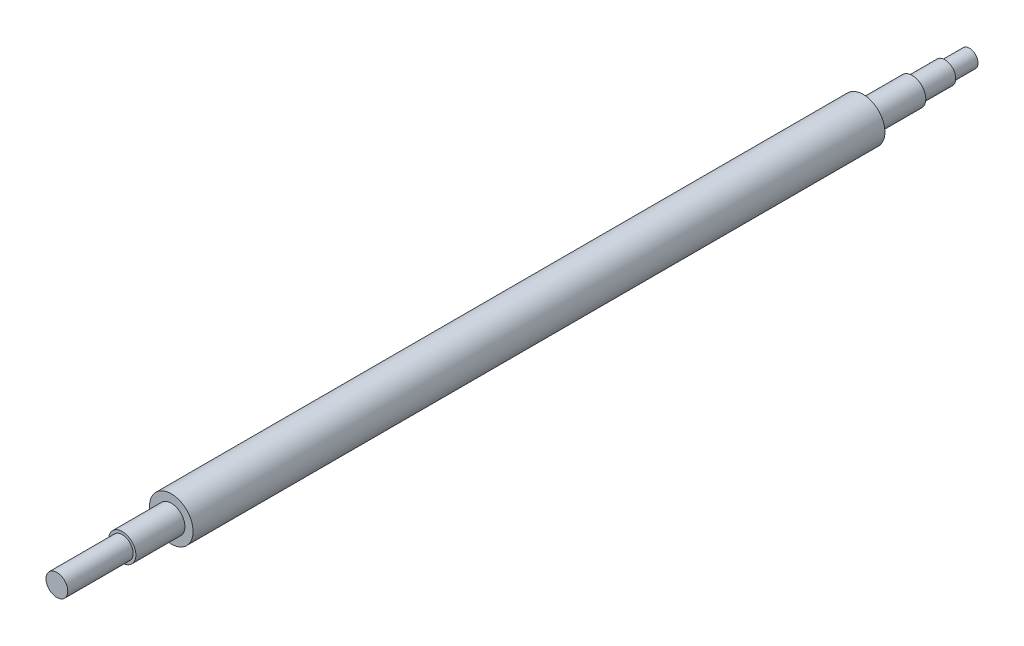
ISO-10303-21;
HEADER;
FILE_DESCRIPTION(('STEP AP214'),'2;1');
FILE_NAME('part.step','',(''),(''),'','','');
FILE_SCHEMA(('AUTOMOTIVE_DESIGN { 1 0 10303 214 1 1 1 1 }'));
ENDSEC;
DATA;
#1=APPLICATION_CONTEXT('core data for automotive mechanical design processes');
#2=APPLICATION_PROTOCOL_DEFINITION('international standard','automotive_design',2000,#1);
#3=PRODUCT_CONTEXT('',#1,'mechanical');
#4=PRODUCT('Part','Part','',(#3));
#5=PRODUCT_RELATED_PRODUCT_CATEGORY('part','',(#4));
#6=PRODUCT_DEFINITION_FORMATION('','',#4);
#7=PRODUCT_DEFINITION_CONTEXT('part definition',#1,'design');
#8=PRODUCT_DEFINITION('design','',#6,#7);
#9=PRODUCT_DEFINITION_SHAPE('','',#8);
#10=(LENGTH_UNIT() NAMED_UNIT(*) SI_UNIT(.MILLI.,.METRE.));
#11=(NAMED_UNIT(*) PLANE_ANGLE_UNIT() SI_UNIT($,.RADIAN.));
#12=(NAMED_UNIT(*) SI_UNIT($,.STERADIAN.) SOLID_ANGLE_UNIT());
#13=UNCERTAINTY_MEASURE_WITH_UNIT(LENGTH_MEASURE(1.E-05),#10,'distance_accuracy_value','');
#14=(GEOMETRIC_REPRESENTATION_CONTEXT(3) GLOBAL_UNCERTAINTY_ASSIGNED_CONTEXT((#13)) GLOBAL_UNIT_ASSIGNED_CONTEXT((#10,
#11,#12)) REPRESENTATION_CONTEXT('',''));
#15=CARTESIAN_POINT('',(0.,0.,0.));
#16=DIRECTION('',(0.,0.,1.));
#17=DIRECTION('',(1.,0.,0.));
#18=AXIS2_PLACEMENT_3D('',#15,#16,#17);
#19=CARTESIAN_POINT('',(0.,0.,296.));
#20=DIRECTION('',(0.,0.,-1.));
#21=DIRECTION('',(-1.,0.,0.));
#22=AXIS2_PLACEMENT_3D('',#19,#20,#21);
#23=CYLINDRICAL_SURFACE('',#22,4.);
#24=CARTESIAN_POINT('',(0.,0.,296.));
#25=DIRECTION('',(0.,0.,1.));
#26=DIRECTION('',(1.,0.,0.));
#27=AXIS2_PLACEMENT_3D('',#24,#25,#26);
#28=CIRCLE('',#27,4.);
#29=CARTESIAN_POINT('',(4.,0.,296.));
#30=VERTEX_POINT('',#29);
#31=EDGE_CURVE('E11',#30,#30,#28,.T.);
#32=ORIENTED_EDGE('',*,*,#31,.F.);
#33=EDGE_LOOP('',(#32));
#34=FACE_BOUND('',#33,.T.);
#35=CARTESIAN_POINT('',(0.,0.,272.));
#36=DIRECTION('',(0.,0.,1.));
#37=DIRECTION('',(1.,0.,0.));
#38=AXIS2_PLACEMENT_3D('',#35,#36,#37);
#39=CIRCLE('',#38,4.);
#40=CARTESIAN_POINT('',(4.,0.,272.));
#41=VERTEX_POINT('',#40);
#42=EDGE_CURVE('E44',#41,#41,#39,.T.);
#43=ORIENTED_EDGE('',*,*,#42,.T.);
#44=EDGE_LOOP('',(#43));
#45=FACE_BOUND('',#44,.T.);
#46=ADVANCED_FACE('F41',(#34,#45),#23,.T.);
#47=CARTESIAN_POINT('',(0.,0.,296.));
#48=DIRECTION('',(0.,0.,1.));
#49=DIRECTION('',(1.,0.,0.));
#50=AXIS2_PLACEMENT_3D('',#47,#48,#49);
#51=PLANE('',#50);
#52=ORIENTED_EDGE('',*,*,#31,.T.);
#53=EDGE_LOOP('',(#52));
#54=FACE_BOUND('',#53,.T.);
#55=ADVANCED_FACE('F56',(#54),#51,.T.);
#56=CARTESIAN_POINT('',(0.,0.,272.));
#57=DIRECTION('',(0.,0.,1.));
#58=DIRECTION('',(1.,0.,0.));
#59=AXIS2_PLACEMENT_3D('',#56,#57,#58);
#60=PLANE('',#59);
#61=ORIENTED_EDGE('',*,*,#42,.F.);
#62=EDGE_LOOP('',(#61));
#63=FACE_BOUND('',#62,.T.);
#64=ADVANCED_FACE('F54',(#63),#60,.F.);
#65=CLOSED_SHELL('',(#46,#55,#64));
#66=MANIFOLD_SOLID_BREP('B2',#65);
#67=CARTESIAN_POINT('',(0.,0.,-30.));
#68=DIRECTION('',(0.,0.,-1.));
#69=DIRECTION('',(-1.,0.,0.));
#70=AXIS2_PLACEMENT_3D('',#67,#68,#69);
#71=PLANE('',#70);
#72=CARTESIAN_POINT('',(0.,0.,-30.));
#73=DIRECTION('',(0.,0.,-1.));
#74=DIRECTION('',(-1.,0.,0.));
#75=AXIS2_PLACEMENT_3D('',#72,#73,#74);
#76=CIRCLE('',#75,4.);
#77=CARTESIAN_POINT('',(-4.,0.,-30.));
#78=VERTEX_POINT('',#77);
#79=EDGE_CURVE('E100',#78,#78,#76,.T.);
#80=ORIENTED_EDGE('',*,*,#79,.T.);
#81=EDGE_LOOP('',(#80));
#82=FACE_BOUND('',#81,.T.);
#83=CARTESIAN_POINT('',(0.,0.,-30.));
#84=DIRECTION('',(0.,0.,-1.));
#85=DIRECTION('',(-1.,0.,0.));
#86=AXIS2_PLACEMENT_3D('',#83,#84,#85);
#87=CIRCLE('',#86,3.175);
#88=CARTESIAN_POINT('',(-3.175,0.,-30.));
#89=VERTEX_POINT('',#88);
#90=EDGE_CURVE('E108',#89,#89,#87,.T.);
#91=ORIENTED_EDGE('',*,*,#90,.F.);
#92=EDGE_LOOP('',(#91));
#93=FACE_BOUND('',#92,.T.);
#94=ADVANCED_FACE('F89',(#82,#93),#71,.T.);
#95=CARTESIAN_POINT('',(0.,0.,-18.));
#96=DIRECTION('',(0.,0.,-1.));
#97=DIRECTION('',(-1.,0.,0.));
#98=AXIS2_PLACEMENT_3D('',#95,#96,#97);
#99=PLANE('',#98);
#100=CARTESIAN_POINT('',(0.,0.,-18.));
#101=DIRECTION('',(0.,0.,-1.));
#102=DIRECTION('',(-1.,0.,0.));
#103=AXIS2_PLACEMENT_3D('',#100,#101,#102);
#104=CIRCLE('',#103,5.);
#105=CARTESIAN_POINT('',(-5.,0.,-18.));
#106=VERTEX_POINT('',#105);
#107=EDGE_CURVE('E40',#106,#106,#104,.T.);
#108=ORIENTED_EDGE('',*,*,#107,.T.);
#109=EDGE_LOOP('',(#108));
#110=FACE_BOUND('',#109,.T.);
#111=CARTESIAN_POINT('',(0.,0.,-18.));
#112=DIRECTION('',(0.,0.,-1.));
#113=DIRECTION('',(-1.,0.,0.));
#114=AXIS2_PLACEMENT_3D('',#111,#112,#113);
#115=CIRCLE('',#114,4.);
#116=CARTESIAN_POINT('',(-4.,0.,-18.));
#117=VERTEX_POINT('',#116);
#118=EDGE_CURVE('E102',#117,#117,#115,.T.);
#119=ORIENTED_EDGE('',*,*,#118,.F.);
#120=EDGE_LOOP('',(#119));
#121=FACE_BOUND('',#120,.T.);
#122=ADVANCED_FACE('F124',(#110,#121),#99,.T.);
#123=CARTESIAN_POINT('',(0.,0.,-18.));
#124=DIRECTION('',(0.,0.,1.));
#125=DIRECTION('',(1.,0.,0.));
#126=AXIS2_PLACEMENT_3D('',#123,#124,#125);
#127=CYLINDRICAL_SURFACE('',#126,5.);
#128=ORIENTED_EDGE('',*,*,#107,.F.);
#129=EDGE_LOOP('',(#128));
#130=FACE_BOUND('',#129,.T.);
#131=CARTESIAN_POINT('',(0.,0.,0.));
#132=DIRECTION('',(0.,0.,-1.));
#133=DIRECTION('',(-1.,0.,0.));
#134=AXIS2_PLACEMENT_3D('',#131,#132,#133);
#135=CIRCLE('',#134,5.);
#136=CARTESIAN_POINT('',(-5.,0.,0.));
#137=VERTEX_POINT('',#136);
#138=EDGE_CURVE('E93',#137,#137,#135,.T.);
#139=ORIENTED_EDGE('',*,*,#138,.T.);
#140=EDGE_LOOP('',(#139));
#141=FACE_BOUND('',#140,.T.);
#142=ADVANCED_FACE('F91',(#130,#141),#127,.T.);
#143=CARTESIAN_POINT('',(0.,0.,0.));
#144=DIRECTION('',(0.,0.,-1.));
#145=DIRECTION('',(-1.,0.,0.));
#146=AXIS2_PLACEMENT_3D('',#143,#144,#145);
#147=PLANE('',#146);
#148=ORIENTED_EDGE('',*,*,#138,.F.);
#149=EDGE_LOOP('',(#148));
#150=FACE_BOUND('',#149,.T.);
#151=ADVANCED_FACE('F134',(#150),#147,.F.);
#152=CARTESIAN_POINT('',(0.,0.,-30.));
#153=DIRECTION('',(0.,0.,1.));
#154=DIRECTION('',(1.,0.,0.));
#155=AXIS2_PLACEMENT_3D('',#152,#153,#154);
#156=CYLINDRICAL_SURFACE('',#155,4.);
#157=ORIENTED_EDGE('',*,*,#79,.F.);
#158=EDGE_LOOP('',(#157));
#159=FACE_BOUND('',#158,.T.);
#160=ORIENTED_EDGE('',*,*,#118,.T.);
#161=EDGE_LOOP('',(#160));
#162=FACE_BOUND('',#161,.T.);
#163=ADVANCED_FACE('F119',(#159,#162),#156,.T.);
#164=CARTESIAN_POINT('',(0.,0.,-39.));
#165=DIRECTION('',(0.,0.,1.));
#166=DIRECTION('',(1.,0.,0.));
#167=AXIS2_PLACEMENT_3D('',#164,#165,#166);
#168=CYLINDRICAL_SURFACE('',#167,3.175);
#169=CARTESIAN_POINT('',(0.,0.,-39.));
#170=DIRECTION('',(0.,0.,-1.));
#171=DIRECTION('',(-1.,0.,0.));
#172=AXIS2_PLACEMENT_3D('',#169,#170,#171);
#173=CIRCLE('',#172,3.175);
#174=CARTESIAN_POINT('',(-3.175,0.,-39.));
#175=VERTEX_POINT('',#174);
#176=EDGE_CURVE('E105',#175,#175,#173,.T.);
#177=ORIENTED_EDGE('',*,*,#176,.F.);
#178=EDGE_LOOP('',(#177));
#179=FACE_BOUND('',#178,.T.);
#180=ORIENTED_EDGE('',*,*,#90,.T.);
#181=EDGE_LOOP('',(#180));
#182=FACE_BOUND('',#181,.T.);
#183=ADVANCED_FACE('F116',(#179,#182),#168,.T.);
#184=CARTESIAN_POINT('',(0.,0.,-39.));
#185=DIRECTION('',(0.,0.,-1.));
#186=DIRECTION('',(-1.,0.,0.));
#187=AXIS2_PLACEMENT_3D('',#184,#185,#186);
#188=PLANE('',#187);
#189=ORIENTED_EDGE('',*,*,#176,.T.);
#190=EDGE_LOOP('',(#189));
#191=FACE_BOUND('',#190,.T.);
#192=ADVANCED_FACE('F114',(#191),#188,.T.);
#193=CLOSED_SHELL('',(#94,#122,#142,#151,#163,#183,#192));
#194=MANIFOLD_SOLID_BREP('B6',#193);
#195=CARTESIAN_POINT('',(0.,0.,272.));
#196=DIRECTION('',(0.,0.,-1.));
#197=DIRECTION('',(-1.,0.,0.));
#198=AXIS2_PLACEMENT_3D('',#195,#196,#197);
#199=CYLINDRICAL_SURFACE('',#198,5.);
#200=CARTESIAN_POINT('',(0.,0.,272.));
#201=DIRECTION('',(0.,0.,1.));
#202=DIRECTION('',(1.,0.,0.));
#203=AXIS2_PLACEMENT_3D('',#200,#201,#202);
#204=CIRCLE('',#203,5.);
#205=CARTESIAN_POINT('',(5.,0.,272.));
#206=VERTEX_POINT('',#205);
#207=EDGE_CURVE('E88',#206,#206,#204,.T.);
#208=ORIENTED_EDGE('',*,*,#207,.F.);
#209=EDGE_LOOP('',(#208));
#210=FACE_BOUND('',#209,.T.);
#211=CARTESIAN_POINT('',(0.,0.,254.));
#212=DIRECTION('',(0.,0.,1.));
#213=DIRECTION('',(1.,0.,0.));
#214=AXIS2_PLACEMENT_3D('',#211,#212,#213);
#215=CIRCLE('',#214,5.);
#216=CARTESIAN_POINT('',(5.,0.,254.));
#217=VERTEX_POINT('',#216);
#218=EDGE_CURVE('E199',#217,#217,#215,.T.);
#219=ORIENTED_EDGE('',*,*,#218,.T.);
#220=EDGE_LOOP('',(#219));
#221=FACE_BOUND('',#220,.T.);
#222=ADVANCED_FACE('F196',(#210,#221),#199,.T.);
#223=CARTESIAN_POINT('',(0.,0.,272.));
#224=DIRECTION('',(0.,0.,1.));
#225=DIRECTION('',(1.,0.,0.));
#226=AXIS2_PLACEMENT_3D('',#223,#224,#225);
#227=PLANE('',#226);
#228=ORIENTED_EDGE('',*,*,#207,.T.);
#229=EDGE_LOOP('',(#228));
#230=FACE_BOUND('',#229,.T.);
#231=ADVANCED_FACE('F211',(#230),#227,.T.);
#232=CARTESIAN_POINT('',(0.,0.,254.));
#233=DIRECTION('',(0.,0.,1.));
#234=DIRECTION('',(1.,0.,0.));
#235=AXIS2_PLACEMENT_3D('',#232,#233,#234);
#236=PLANE('',#235);
#237=ORIENTED_EDGE('',*,*,#218,.F.);
#238=EDGE_LOOP('',(#237));
#239=FACE_BOUND('',#238,.T.);
#240=ADVANCED_FACE('F209',(#239),#236,.F.);
#241=CLOSED_SHELL('',(#222,#231,#240));
#242=MANIFOLD_SOLID_BREP('B35',#241);
#243=CARTESIAN_POINT('',(0.,0.,254.));
#244=DIRECTION('',(0.,0.,-1.));
#245=DIRECTION('',(-1.,0.,0.));
#246=AXIS2_PLACEMENT_3D('',#243,#244,#245);
#247=CYLINDRICAL_SURFACE('',#246,8.);
#248=CARTESIAN_POINT('',(0.,0.,254.));
#249=DIRECTION('',(0.,0.,1.));
#250=DIRECTION('',(1.,0.,0.));
#251=AXIS2_PLACEMENT_3D('',#248,#249,#250);
#252=CIRCLE('',#251,8.);
#253=CARTESIAN_POINT('',(8.,0.,254.));
#254=VERTEX_POINT('',#253);
#255=EDGE_CURVE('E195',#254,#254,#252,.T.);
#256=ORIENTED_EDGE('',*,*,#255,.F.);
#257=EDGE_LOOP('',(#256));
#258=FACE_BOUND('',#257,.T.);
#259=CARTESIAN_POINT('',(0.,0.,0.));
#260=DIRECTION('',(0.,0.,1.));
#261=DIRECTION('',(1.,0.,0.));
#262=AXIS2_PLACEMENT_3D('',#259,#260,#261);
#263=CIRCLE('',#262,8.);
#264=CARTESIAN_POINT('',(8.,0.,0.));
#265=VERTEX_POINT('',#264);
#266=EDGE_CURVE('E239',#265,#265,#263,.T.);
#267=ORIENTED_EDGE('',*,*,#266,.T.);
#268=EDGE_LOOP('',(#267));
#269=FACE_BOUND('',#268,.T.);
#270=ADVANCED_FACE('F236',(#258,#269),#247,.T.);
#271=CARTESIAN_POINT('',(0.,0.,254.));
#272=DIRECTION('',(0.,0.,1.));
#273=DIRECTION('',(1.,0.,0.));
#274=AXIS2_PLACEMENT_3D('',#271,#272,#273);
#275=PLANE('',#274);
#276=ORIENTED_EDGE('',*,*,#255,.T.);
#277=EDGE_LOOP('',(#276));
#278=FACE_BOUND('',#277,.T.);
#279=ADVANCED_FACE('F251',(#278),#275,.T.);
#280=CARTESIAN_POINT('',(0.,0.,0.));
#281=DIRECTION('',(0.,0.,1.));
#282=DIRECTION('',(1.,0.,0.));
#283=AXIS2_PLACEMENT_3D('',#280,#281,#282);
#284=PLANE('',#283);
#285=ORIENTED_EDGE('',*,*,#266,.F.);
#286=EDGE_LOOP('',(#285));
#287=FACE_BOUND('',#286,.T.);
#288=ADVANCED_FACE('F249',(#287),#284,.F.);
#289=CLOSED_SHELL('',(#270,#279,#288));
#290=MANIFOLD_SOLID_BREP('B83',#289);
#291=ADVANCED_BREP_SHAPE_REPRESENTATION('',(#18,#66,#194,#242,#290),#14);
#292=SHAPE_DEFINITION_REPRESENTATION(#9,#291);
ENDSEC;
END-ISO-10303-21;
